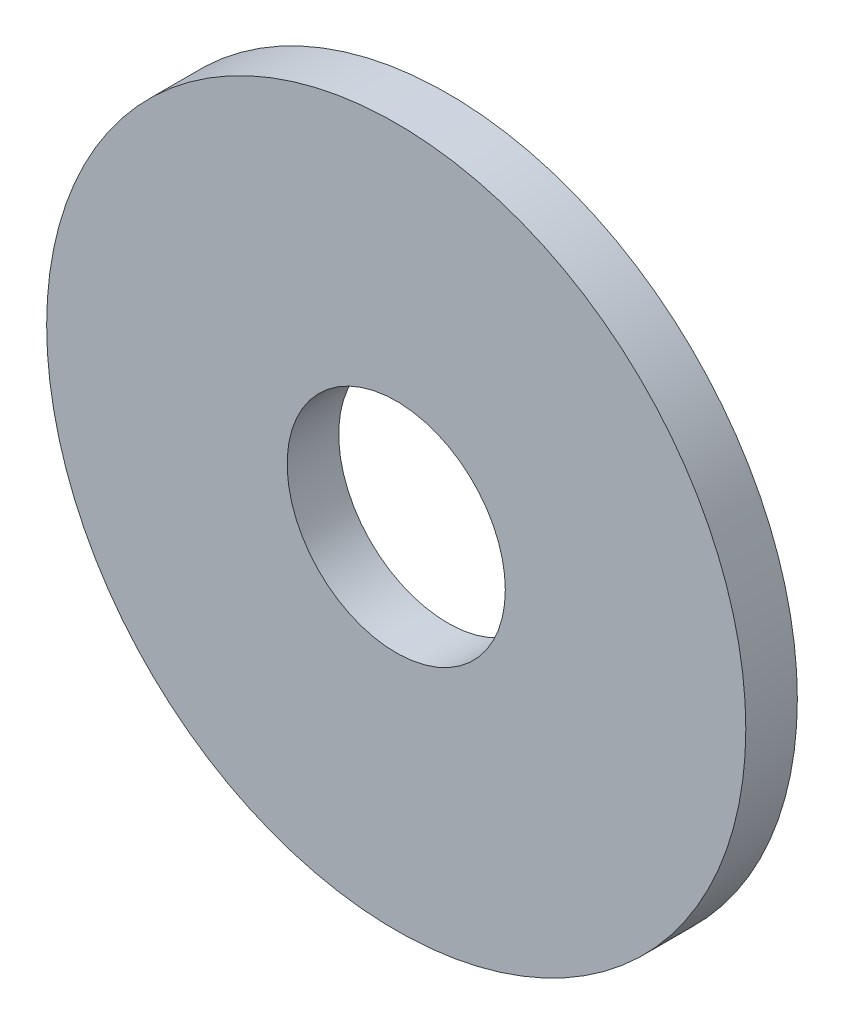
ISO-10303-21;
HEADER;
FILE_DESCRIPTION(('STEP AP214'),'2;1');
FILE_NAME('part.step','',(''),(''),'','','');
FILE_SCHEMA(('AUTOMOTIVE_DESIGN { 1 0 10303 214 1 1 1 1 }'));
ENDSEC;
DATA;
#1=APPLICATION_CONTEXT('core data for automotive mechanical design processes');
#2=APPLICATION_PROTOCOL_DEFINITION('international standard','automotive_design',2000,#1);
#3=PRODUCT_CONTEXT('',#1,'mechanical');
#4=PRODUCT('Part','Part','',(#3));
#5=PRODUCT_RELATED_PRODUCT_CATEGORY('part','',(#4));
#6=PRODUCT_DEFINITION_FORMATION('','',#4);
#7=PRODUCT_DEFINITION_CONTEXT('part definition',#1,'design');
#8=PRODUCT_DEFINITION('design','',#6,#7);
#9=PRODUCT_DEFINITION_SHAPE('','',#8);
#10=(LENGTH_UNIT() NAMED_UNIT(*) SI_UNIT(.MILLI.,.METRE.));
#11=(NAMED_UNIT(*) PLANE_ANGLE_UNIT() SI_UNIT($,.RADIAN.));
#12=(NAMED_UNIT(*) SI_UNIT($,.STERADIAN.) SOLID_ANGLE_UNIT());
#13=UNCERTAINTY_MEASURE_WITH_UNIT(LENGTH_MEASURE(1.E-05),#10,'distance_accuracy_value','');
#14=(GEOMETRIC_REPRESENTATION_CONTEXT(3) GLOBAL_UNCERTAINTY_ASSIGNED_CONTEXT((#13)) GLOBAL_UNIT_ASSIGNED_CONTEXT((#10,
#11,#12)) REPRESENTATION_CONTEXT('',''));
#15=CARTESIAN_POINT('',(0.,0.,0.));
#16=DIRECTION('',(0.,0.,1.));
#17=DIRECTION('',(1.,0.,0.));
#18=AXIS2_PLACEMENT_3D('',#15,#16,#17);
#19=CARTESIAN_POINT('',(-5.06519506104383,3.50945657800895,1.5));
#20=DIRECTION('',(0.,0.,1.));
#21=DIRECTION('',(1.,0.,0.));
#22=AXIS2_PLACEMENT_3D('',#19,#20,#21);
#23=PLANE('',#22);
#24=CARTESIAN_POINT('',(-5.06519506104383,3.50945657800895,1.5));
#25=DIRECTION('',(0.,0.,1.));
#26=DIRECTION('',(1.,0.,0.));
#27=AXIS2_PLACEMENT_3D('',#24,#25,#26);
#28=CIRCLE('',#27,10.175);
#29=CARTESIAN_POINT('',(5.10980493895617,3.50945657800895,1.5));
#30=VERTEX_POINT('',#29);
#31=EDGE_CURVE('E10',#30,#30,#28,.T.);
#32=ORIENTED_EDGE('',*,*,#31,.T.);
#33=EDGE_LOOP('',(#32));
#34=FACE_BOUND('',#33,.T.);
#35=CARTESIAN_POINT('',(-5.06519506104383,3.50945657800895,1.5));
#36=DIRECTION('',(0.,0.,1.));
#37=DIRECTION('',(1.,0.,0.));
#38=AXIS2_PLACEMENT_3D('',#35,#36,#37);
#39=CIRCLE('',#38,3.175);
#40=CARTESIAN_POINT('',(-1.89019506104383,3.50945657800895,1.5));
#41=VERTEX_POINT('',#40);
#42=EDGE_CURVE('E50',#41,#41,#39,.T.);
#43=ORIENTED_EDGE('',*,*,#42,.F.);
#44=EDGE_LOOP('',(#43));
#45=FACE_BOUND('',#44,.T.);
#46=ADVANCED_FACE('F37',(#34,#45),#23,.T.);
#47=CARTESIAN_POINT('',(-5.06519506104383,3.50945657800895,0.));
#48=DIRECTION('',(0.,0.,1.));
#49=DIRECTION('',(1.,0.,0.));
#50=AXIS2_PLACEMENT_3D('',#47,#48,#49);
#51=PLANE('',#50);
#52=CARTESIAN_POINT('',(-5.06519506104383,3.50945657800895,0.));
#53=DIRECTION('',(0.,0.,1.));
#54=DIRECTION('',(1.,0.,0.));
#55=AXIS2_PLACEMENT_3D('',#52,#53,#54);
#56=CIRCLE('',#55,10.175);
#57=CARTESIAN_POINT('',(5.10980493895617,3.50945657800895,0.));
#58=VERTEX_POINT('',#57);
#59=EDGE_CURVE('E41',#58,#58,#56,.T.);
#60=ORIENTED_EDGE('',*,*,#59,.F.);
#61=EDGE_LOOP('',(#60));
#62=FACE_BOUND('',#61,.T.);
#63=CARTESIAN_POINT('',(-5.06519506104383,3.50945657800895,0.));
#64=DIRECTION('',(0.,0.,1.));
#65=DIRECTION('',(1.,0.,0.));
#66=AXIS2_PLACEMENT_3D('',#63,#64,#65);
#67=CIRCLE('',#66,3.175);
#68=CARTESIAN_POINT('',(-1.89019506104383,3.50945657800895,0.));
#69=VERTEX_POINT('',#68);
#70=EDGE_CURVE('E52',#69,#69,#67,.T.);
#71=ORIENTED_EDGE('',*,*,#70,.T.);
#72=EDGE_LOOP('',(#71));
#73=FACE_BOUND('',#72,.T.);
#74=ADVANCED_FACE('F64',(#62,#73),#51,.F.);
#75=CARTESIAN_POINT('',(-5.06519506104383,3.50945657800895,1.5));
#76=DIRECTION('',(0.,0.,-1.));
#77=DIRECTION('',(-1.,0.,0.));
#78=AXIS2_PLACEMENT_3D('',#75,#76,#77);
#79=CYLINDRICAL_SURFACE('',#78,10.175);
#80=ORIENTED_EDGE('',*,*,#31,.F.);
#81=EDGE_LOOP('',(#80));
#82=FACE_BOUND('',#81,.T.);
#83=ORIENTED_EDGE('',*,*,#59,.T.);
#84=EDGE_LOOP('',(#83));
#85=FACE_BOUND('',#84,.T.);
#86=ADVANCED_FACE('F39',(#82,#85),#79,.T.);
#87=CARTESIAN_POINT('',(-5.06519506104383,3.50945657800895,1.5));
#88=DIRECTION('',(0.,0.,-1.));
#89=DIRECTION('',(-1.,0.,0.));
#90=AXIS2_PLACEMENT_3D('',#87,#88,#89);
#91=CYLINDRICAL_SURFACE('',#90,3.175);
#92=ORIENTED_EDGE('',*,*,#42,.T.);
#93=EDGE_LOOP('',(#92));
#94=FACE_BOUND('',#93,.T.);
#95=ORIENTED_EDGE('',*,*,#70,.F.);
#96=EDGE_LOOP('',(#95));
#97=FACE_BOUND('',#96,.T.);
#98=ADVANCED_FACE('F60',(#94,#97),#91,.F.);
#99=CLOSED_SHELL('',(#46,#74,#86,#98));
#100=MANIFOLD_SOLID_BREP('B2',#99);
#101=ADVANCED_BREP_SHAPE_REPRESENTATION('',(#18,#100),#14);
#102=SHAPE_DEFINITION_REPRESENTATION(#9,#101);
ENDSEC;
END-ISO-10303-21;
